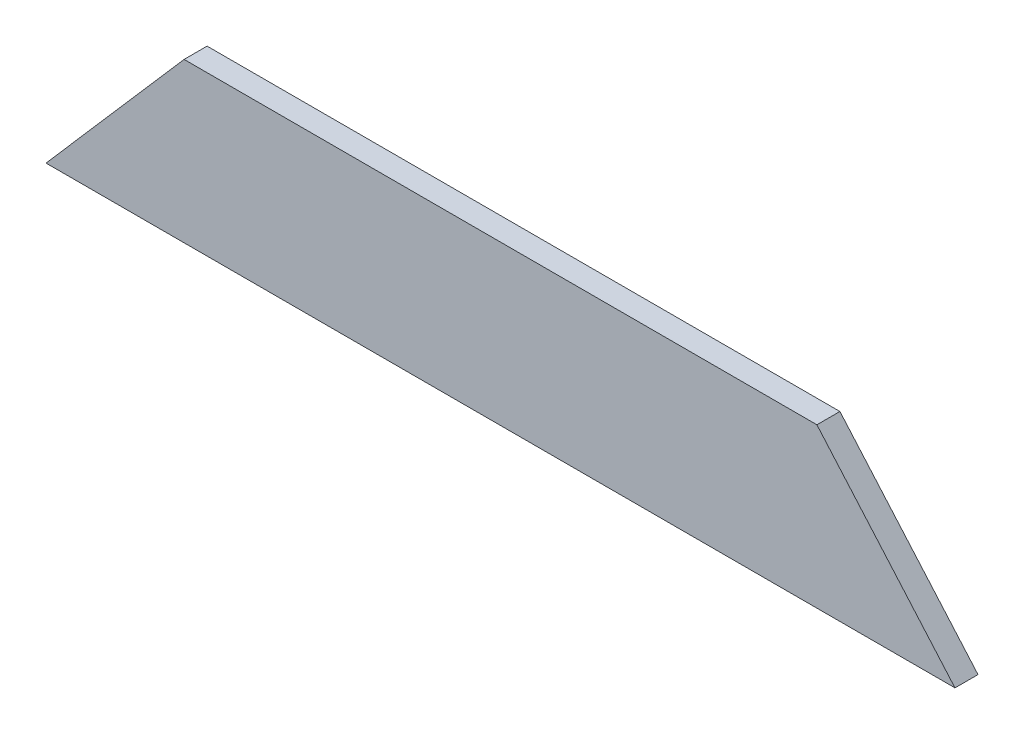
ISO-10303-21;
HEADER;
FILE_DESCRIPTION(('STEP AP214'),'2;1');
FILE_NAME('part.step','',(''),(''),'','','');
FILE_SCHEMA(('AUTOMOTIVE_DESIGN { 1 0 10303 214 1 1 1 1 }'));
ENDSEC;
DATA;
#1=APPLICATION_CONTEXT('core data for automotive mechanical design processes');
#2=APPLICATION_PROTOCOL_DEFINITION('international standard','automotive_design',2000,#1);
#3=PRODUCT_CONTEXT('',#1,'mechanical');
#4=PRODUCT('Part','Part','',(#3));
#5=PRODUCT_RELATED_PRODUCT_CATEGORY('part','',(#4));
#6=PRODUCT_DEFINITION_FORMATION('','',#4);
#7=PRODUCT_DEFINITION_CONTEXT('part definition',#1,'design');
#8=PRODUCT_DEFINITION('design','',#6,#7);
#9=PRODUCT_DEFINITION_SHAPE('','',#8);
#10=(LENGTH_UNIT() NAMED_UNIT(*) SI_UNIT(.MILLI.,.METRE.));
#11=(NAMED_UNIT(*) PLANE_ANGLE_UNIT() SI_UNIT($,.RADIAN.));
#12=(NAMED_UNIT(*) SI_UNIT($,.STERADIAN.) SOLID_ANGLE_UNIT());
#13=UNCERTAINTY_MEASURE_WITH_UNIT(LENGTH_MEASURE(1.E-05),#10,'distance_accuracy_value','');
#14=(GEOMETRIC_REPRESENTATION_CONTEXT(3) GLOBAL_UNCERTAINTY_ASSIGNED_CONTEXT((#13)) GLOBAL_UNIT_ASSIGNED_CONTEXT((#10,
#11,#12)) REPRESENTATION_CONTEXT('',''));
#15=CARTESIAN_POINT('',(0.,0.,0.));
#16=DIRECTION('',(0.,0.,1.));
#17=DIRECTION('',(1.,0.,0.));
#18=AXIS2_PLACEMENT_3D('',#15,#16,#17);
#19=CARTESIAN_POINT('',(12.,13.804420886652,2.));
#20=DIRECTION('',(0.754709580222769,-0.656059028990511,0.));
#21=DIRECTION('',(0.656059028990511,0.754709580222769,0.));
#22=AXIS2_PLACEMENT_3D('',#19,#20,#21);
#23=PLANE('',#22);
#24=DIRECTION('',(-0.656059028990511,-0.754709580222769,0.));
#25=VECTOR('',#24,1.);
#26=CARTESIAN_POINT('',(12.,13.804420886652,0.));
#27=LINE('',#26,#25);
#28=CARTESIAN_POINT('',(12.,13.804420886652,0.));
#29=VERTEX_POINT('',#28);
#30=CARTESIAN_POINT('',(0.,0.,0.));
#31=VERTEX_POINT('',#30);
#32=EDGE_CURVE('E100',#29,#31,#27,.T.);
#33=ORIENTED_EDGE('',*,*,#32,.T.);
#34=DIRECTION('',(0.,0.,-1.));
#35=VECTOR('',#34,1.);
#36=CARTESIAN_POINT('',(0.,0.,2.));
#37=LINE('',#36,#35);
#38=CARTESIAN_POINT('',(0.,0.,2.));
#39=VERTEX_POINT('',#38);
#40=EDGE_CURVE('E11',#39,#31,#37,.T.);
#41=ORIENTED_EDGE('',*,*,#40,.F.);
#42=DIRECTION('',(-0.656059028990511,-0.754709580222769,0.));
#43=VECTOR('',#42,1.);
#44=CARTESIAN_POINT('',(12.,13.804420886652,2.));
#45=LINE('',#44,#43);
#46=CARTESIAN_POINT('',(12.,13.804420886652,2.));
#47=VERTEX_POINT('',#46);
#48=EDGE_CURVE('E88',#47,#39,#45,.T.);
#49=ORIENTED_EDGE('',*,*,#48,.F.);
#50=DIRECTION('',(0.,0.,-1.));
#51=VECTOR('',#50,1.);
#52=CARTESIAN_POINT('',(12.,13.804420886652,2.));
#53=LINE('',#52,#51);
#54=EDGE_CURVE('E96',#47,#29,#53,.T.);
#55=ORIENTED_EDGE('',*,*,#54,.T.);
#56=EDGE_LOOP('',(#33,#41,#49,#55));
#57=FACE_BOUND('',#56,.T.);
#58=ADVANCED_FACE('F37',(#57),#23,.F.);
#59=CARTESIAN_POINT('',(0.,0.,2.));
#60=DIRECTION('',(0.,1.,0.));
#61=DIRECTION('',(0.,0.,1.));
#62=AXIS2_PLACEMENT_3D('',#59,#60,#61);
#63=PLANE('',#62);
#64=DIRECTION('',(1.,0.,0.));
#65=VECTOR('',#64,1.);
#66=CARTESIAN_POINT('',(0.,0.,0.));
#67=LINE('',#66,#65);
#68=CARTESIAN_POINT('',(79.,0.,0.));
#69=VERTEX_POINT('',#68);
#70=EDGE_CURVE('E92',#31,#69,#67,.T.);
#71=ORIENTED_EDGE('',*,*,#70,.T.);
#72=DIRECTION('',(0.,0.,-1.));
#73=VECTOR('',#72,1.);
#74=CARTESIAN_POINT('',(79.,0.,2.));
#75=LINE('',#74,#73);
#76=CARTESIAN_POINT('',(79.,0.,2.));
#77=VERTEX_POINT('',#76);
#78=EDGE_CURVE('E45',#77,#69,#75,.T.);
#79=ORIENTED_EDGE('',*,*,#78,.F.);
#80=DIRECTION('',(1.,0.,0.));
#81=VECTOR('',#80,1.);
#82=CARTESIAN_POINT('',(0.,0.,2.));
#83=LINE('',#82,#81);
#84=EDGE_CURVE('E83',#39,#77,#83,.T.);
#85=ORIENTED_EDGE('',*,*,#84,.F.);
#86=ORIENTED_EDGE('',*,*,#40,.T.);
#87=EDGE_LOOP('',(#71,#79,#85,#86));
#88=FACE_BOUND('',#87,.T.);
#89=ADVANCED_FACE('F91',(#88),#63,.F.);
#90=CARTESIAN_POINT('',(79.,0.,2.));
#91=DIRECTION('',(-0.754709580222769,-0.656059028990511,0.));
#92=DIRECTION('',(0.656059028990511,-0.754709580222769,0.));
#93=AXIS2_PLACEMENT_3D('',#90,#91,#92);
#94=PLANE('',#93);
#95=DIRECTION('',(-0.656059028990511,0.754709580222769,0.));
#96=VECTOR('',#95,1.);
#97=CARTESIAN_POINT('',(79.,0.,0.));
#98=LINE('',#97,#96);
#99=CARTESIAN_POINT('',(67.,13.804420886652,0.));
#100=VERTEX_POINT('',#99);
#101=EDGE_CURVE('E70',#69,#100,#98,.T.);
#102=ORIENTED_EDGE('',*,*,#101,.T.);
#103=DIRECTION('',(0.,0.,-1.));
#104=VECTOR('',#103,1.);
#105=CARTESIAN_POINT('',(67.,13.804420886652,2.));
#106=LINE('',#105,#104);
#107=CARTESIAN_POINT('',(67.,13.804420886652,2.));
#108=VERTEX_POINT('',#107);
#109=EDGE_CURVE('E93',#108,#100,#106,.T.);
#110=ORIENTED_EDGE('',*,*,#109,.F.);
#111=DIRECTION('',(-0.656059028990511,0.754709580222769,0.));
#112=VECTOR('',#111,1.);
#113=CARTESIAN_POINT('',(79.,0.,2.));
#114=LINE('',#113,#112);
#115=EDGE_CURVE('E86',#77,#108,#114,.T.);
#116=ORIENTED_EDGE('',*,*,#115,.F.);
#117=ORIENTED_EDGE('',*,*,#78,.T.);
#118=EDGE_LOOP('',(#102,#110,#116,#117));
#119=FACE_BOUND('',#118,.T.);
#120=ADVANCED_FACE('F94',(#119),#94,.F.);
#121=CARTESIAN_POINT('',(67.,13.804420886652,2.));
#122=DIRECTION('',(0.,-1.,0.));
#123=DIRECTION('',(1.,0.,0.));
#124=AXIS2_PLACEMENT_3D('',#121,#122,#123);
#125=PLANE('',#124);
#126=DIRECTION('',(-1.,0.,0.));
#127=VECTOR('',#126,1.);
#128=CARTESIAN_POINT('',(67.,13.804420886652,0.));
#129=LINE('',#128,#127);
#130=EDGE_CURVE('E76',#100,#29,#129,.T.);
#131=ORIENTED_EDGE('',*,*,#130,.T.);
#132=ORIENTED_EDGE('',*,*,#54,.F.);
#133=DIRECTION('',(-1.,0.,0.));
#134=VECTOR('',#133,1.);
#135=CARTESIAN_POINT('',(67.,13.804420886652,2.));
#136=LINE('',#135,#134);
#137=EDGE_CURVE('E53',#108,#47,#136,.T.);
#138=ORIENTED_EDGE('',*,*,#137,.F.);
#139=ORIENTED_EDGE('',*,*,#109,.T.);
#140=EDGE_LOOP('',(#131,#132,#138,#139));
#141=FACE_BOUND('',#140,.T.);
#142=ADVANCED_FACE('F107',(#141),#125,.F.);
#143=CARTESIAN_POINT('',(0.,0.,2.));
#144=DIRECTION('',(0.,0.,-1.));
#145=DIRECTION('',(-1.,0.,0.));
#146=AXIS2_PLACEMENT_3D('',#143,#144,#145);
#147=PLANE('',#146);
#148=ORIENTED_EDGE('',*,*,#48,.T.);
#149=ORIENTED_EDGE('',*,*,#84,.T.);
#150=ORIENTED_EDGE('',*,*,#115,.T.);
#151=ORIENTED_EDGE('',*,*,#137,.T.);
#152=EDGE_LOOP('',(#148,#149,#150,#151));
#153=FACE_BOUND('',#152,.T.);
#154=ADVANCED_FACE('F84',(#153),#147,.F.);
#155=CARTESIAN_POINT('',(0.,0.,0.));
#156=DIRECTION('',(0.,0.,-1.));
#157=DIRECTION('',(-1.,0.,0.));
#158=AXIS2_PLACEMENT_3D('',#155,#156,#157);
#159=PLANE('',#158);
#160=ORIENTED_EDGE('',*,*,#32,.F.);
#161=ORIENTED_EDGE('',*,*,#130,.F.);
#162=ORIENTED_EDGE('',*,*,#101,.F.);
#163=ORIENTED_EDGE('',*,*,#70,.F.);
#164=EDGE_LOOP('',(#160,#161,#162,#163));
#165=FACE_BOUND('',#164,.T.);
#166=ADVANCED_FACE('F110',(#165),#159,.T.);
#167=CLOSED_SHELL('',(#58,#89,#120,#142,#154,#166));
#168=MANIFOLD_SOLID_BREP('B2',#167);
#169=ADVANCED_BREP_SHAPE_REPRESENTATION('',(#18,#168),#14);
#170=SHAPE_DEFINITION_REPRESENTATION(#9,#169);
ENDSEC;
END-ISO-10303-21;
